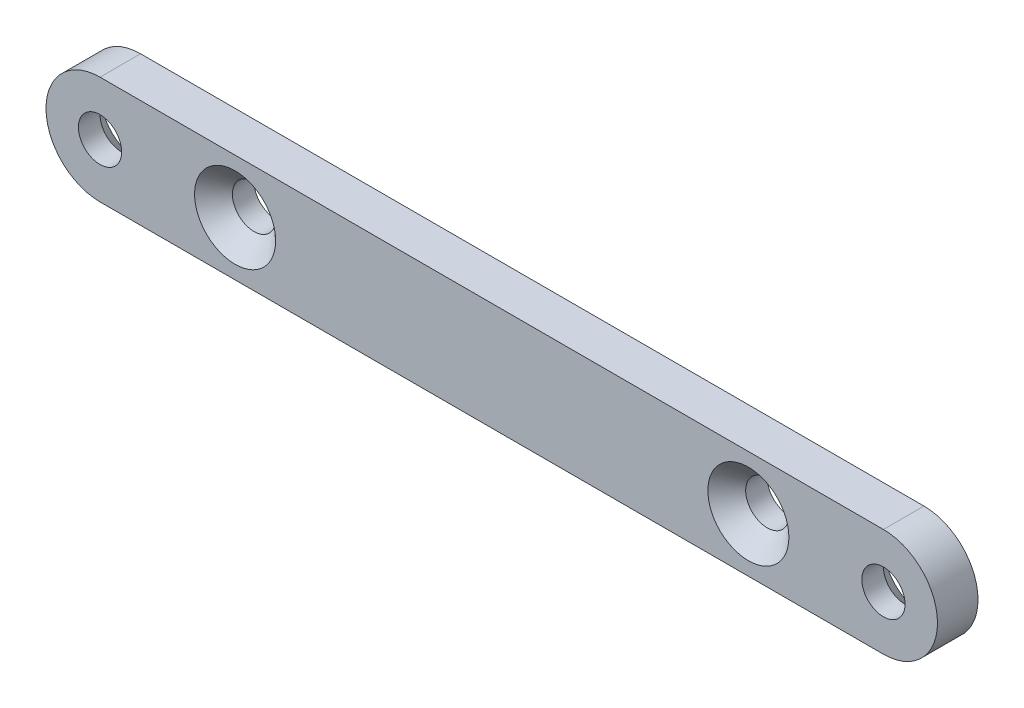
ISO-10303-21;
HEADER;
FILE_DESCRIPTION(('STEP AP214'),'2;1');
FILE_NAME('part.step','',(''),(''),'','','');
FILE_SCHEMA(('AUTOMOTIVE_DESIGN { 1 0 10303 214 1 1 1 1 }'));
ENDSEC;
DATA;
#1=APPLICATION_CONTEXT('core data for automotive mechanical design processes');
#2=APPLICATION_PROTOCOL_DEFINITION('international standard','automotive_design',2000,#1);
#3=PRODUCT_CONTEXT('',#1,'mechanical');
#4=PRODUCT('Part','Part','',(#3));
#5=PRODUCT_RELATED_PRODUCT_CATEGORY('part','',(#4));
#6=PRODUCT_DEFINITION_FORMATION('','',#4);
#7=PRODUCT_DEFINITION_CONTEXT('part definition',#1,'design');
#8=PRODUCT_DEFINITION('design','',#6,#7);
#9=PRODUCT_DEFINITION_SHAPE('','',#8);
#10=(LENGTH_UNIT() NAMED_UNIT(*) SI_UNIT(.MILLI.,.METRE.));
#11=(NAMED_UNIT(*) PLANE_ANGLE_UNIT() SI_UNIT($,.RADIAN.));
#12=(NAMED_UNIT(*) SI_UNIT($,.STERADIAN.) SOLID_ANGLE_UNIT());
#13=UNCERTAINTY_MEASURE_WITH_UNIT(LENGTH_MEASURE(1.E-05),#10,'distance_accuracy_value','');
#14=(GEOMETRIC_REPRESENTATION_CONTEXT(3) GLOBAL_UNCERTAINTY_ASSIGNED_CONTEXT((#13)) GLOBAL_UNIT_ASSIGNED_CONTEXT((#10,
#11,#12)) REPRESENTATION_CONTEXT('',''));
#15=CARTESIAN_POINT('',(0.,0.,0.));
#16=DIRECTION('',(0.,0.,1.));
#17=DIRECTION('',(1.,0.,0.));
#18=AXIS2_PLACEMENT_3D('',#15,#16,#17);
#19=CARTESIAN_POINT('',(0.,-4.,3.));
#20=DIRECTION('',(0.,1.,0.));
#21=DIRECTION('',(0.,0.,1.));
#22=AXIS2_PLACEMENT_3D('',#19,#20,#21);
#23=PLANE('',#22);
#24=DIRECTION('',(1.,0.,0.));
#25=VECTOR('',#24,1.);
#26=CARTESIAN_POINT('',(0.,-4.,0.));
#27=LINE('',#26,#25);
#28=CARTESIAN_POINT('',(-10.,-4.,0.));
#29=VERTEX_POINT('',#28);
#30=CARTESIAN_POINT('',(48.,-4.,0.));
#31=VERTEX_POINT('',#30);
#32=EDGE_CURVE('E113',#29,#31,#27,.T.);
#33=ORIENTED_EDGE('',*,*,#32,.T.);
#34=DIRECTION('',(0.,0.,-1.));
#35=VECTOR('',#34,1.);
#36=CARTESIAN_POINT('',(48.,-4.,3.));
#37=LINE('',#36,#35);
#38=CARTESIAN_POINT('',(48.,-4.,3.));
#39=VERTEX_POINT('',#38);
#40=EDGE_CURVE('E99',#39,#31,#37,.T.);
#41=ORIENTED_EDGE('',*,*,#40,.F.);
#42=DIRECTION('',(1.,0.,0.));
#43=VECTOR('',#42,1.);
#44=CARTESIAN_POINT('',(0.,-4.,3.));
#45=LINE('',#44,#43);
#46=CARTESIAN_POINT('',(-10.,-4.,3.));
#47=VERTEX_POINT('',#46);
#48=EDGE_CURVE('E89',#47,#39,#45,.T.);
#49=ORIENTED_EDGE('',*,*,#48,.F.);
#50=DIRECTION('',(0.,0.,-1.));
#51=VECTOR('',#50,1.);
#52=CARTESIAN_POINT('',(-10.,-4.,3.));
#53=LINE('',#52,#51);
#54=EDGE_CURVE('E103',#47,#29,#53,.T.);
#55=ORIENTED_EDGE('',*,*,#54,.T.);
#56=EDGE_LOOP('',(#33,#41,#49,#55));
#57=FACE_BOUND('',#56,.T.);
#58=ADVANCED_FACE('F39',(#57),#23,.F.);
#59=CARTESIAN_POINT('',(48.,0.,3.));
#60=DIRECTION('',(0.,0.,-1.));
#61=DIRECTION('',(-1.,0.,0.));
#62=AXIS2_PLACEMENT_3D('',#59,#60,#61);
#63=CYLINDRICAL_SURFACE('',#62,4.);
#64=CARTESIAN_POINT('',(48.,0.,0.));
#65=DIRECTION('',(0.,0.,1.));
#66=DIRECTION('',(1.,0.,0.));
#67=AXIS2_PLACEMENT_3D('',#64,#65,#66);
#68=CIRCLE('',#67,4.);
#69=CARTESIAN_POINT('',(48.,4.,0.));
#70=VERTEX_POINT('',#69);
#71=EDGE_CURVE('E95',#31,#70,#68,.T.);
#72=ORIENTED_EDGE('',*,*,#71,.T.);
#73=DIRECTION('',(0.,0.,-1.));
#74=VECTOR('',#73,1.);
#75=CARTESIAN_POINT('',(48.,4.,3.));
#76=LINE('',#75,#74);
#77=CARTESIAN_POINT('',(48.,4.,3.));
#78=VERTEX_POINT('',#77);
#79=EDGE_CURVE('E93',#78,#70,#76,.T.);
#80=ORIENTED_EDGE('',*,*,#79,.F.);
#81=CARTESIAN_POINT('',(48.,0.,3.));
#82=DIRECTION('',(0.,0.,1.));
#83=DIRECTION('',(1.,0.,0.));
#84=AXIS2_PLACEMENT_3D('',#81,#82,#83);
#85=CIRCLE('',#84,4.);
#86=EDGE_CURVE('E84',#39,#78,#85,.T.);
#87=ORIENTED_EDGE('',*,*,#86,.F.);
#88=ORIENTED_EDGE('',*,*,#40,.T.);
#89=EDGE_LOOP('',(#72,#80,#87,#88));
#90=FACE_BOUND('',#89,.T.);
#91=ADVANCED_FACE('F94',(#90),#63,.T.);
#92=CARTESIAN_POINT('',(0.,4.,3.));
#93=DIRECTION('',(0.,1.,0.));
#94=DIRECTION('',(0.,0.,1.));
#95=AXIS2_PLACEMENT_3D('',#92,#93,#94);
#96=PLANE('',#95);
#97=DIRECTION('',(1.,0.,0.));
#98=VECTOR('',#97,1.);
#99=CARTESIAN_POINT('',(0.,4.,0.));
#100=LINE('',#99,#98);
#101=CARTESIAN_POINT('',(-10.,4.,0.));
#102=VERTEX_POINT('',#101);
#103=EDGE_CURVE('E117',#102,#70,#100,.T.);
#104=ORIENTED_EDGE('',*,*,#103,.F.);
#105=DIRECTION('',(0.,0.,-1.));
#106=VECTOR('',#105,1.);
#107=CARTESIAN_POINT('',(-10.,4.,3.));
#108=LINE('',#107,#106);
#109=CARTESIAN_POINT('',(-10.,4.,3.));
#110=VERTEX_POINT('',#109);
#111=EDGE_CURVE('E73',#110,#102,#108,.T.);
#112=ORIENTED_EDGE('',*,*,#111,.F.);
#113=DIRECTION('',(1.,0.,0.));
#114=VECTOR('',#113,1.);
#115=CARTESIAN_POINT('',(0.,4.,3.));
#116=LINE('',#115,#114);
#117=EDGE_CURVE('E87',#110,#78,#116,.T.);
#118=ORIENTED_EDGE('',*,*,#117,.T.);
#119=ORIENTED_EDGE('',*,*,#79,.T.);
#120=EDGE_LOOP('',(#104,#112,#118,#119));
#121=FACE_BOUND('',#120,.T.);
#122=ADVANCED_FACE('F101',(#121),#96,.T.);
#123=CARTESIAN_POINT('',(-10.,0.,3.));
#124=DIRECTION('',(0.,0.,-1.));
#125=DIRECTION('',(-1.,0.,0.));
#126=AXIS2_PLACEMENT_3D('',#123,#124,#125);
#127=CYLINDRICAL_SURFACE('',#126,1.6);
#128=CARTESIAN_POINT('',(-10.,0.,1.4));
#129=DIRECTION('',(0.,0.,1.));
#130=DIRECTION('',(1.,0.,0.));
#131=AXIS2_PLACEMENT_3D('',#128,#129,#130);
#132=CIRCLE('',#131,1.6);
#133=CARTESIAN_POINT('',(-8.4,0.,1.4));
#134=VERTEX_POINT('',#133);
#135=EDGE_CURVE('E133',#134,#134,#132,.F.);
#136=ORIENTED_EDGE('',*,*,#135,.T.);
#137=EDGE_LOOP('',(#136));
#138=FACE_BOUND('',#137,.T.);
#139=CARTESIAN_POINT('',(-10.,0.,3.));
#140=DIRECTION('',(0.,0.,1.));
#141=DIRECTION('',(1.,0.,0.));
#142=AXIS2_PLACEMENT_3D('',#139,#140,#141);
#143=CIRCLE('',#142,1.6);
#144=CARTESIAN_POINT('',(-8.4,0.,3.));
#145=VERTEX_POINT('',#144);
#146=EDGE_CURVE('E221',#145,#145,#143,.T.);
#147=ORIENTED_EDGE('',*,*,#146,.T.);
#148=EDGE_LOOP('',(#147));
#149=FACE_BOUND('',#148,.T.);
#150=ADVANCED_FACE('F186',(#138,#149),#127,.F.);
#151=CARTESIAN_POINT('',(48.,0.,3.));
#152=DIRECTION('',(0.,0.,-1.));
#153=DIRECTION('',(-1.,0.,0.));
#154=AXIS2_PLACEMENT_3D('',#151,#152,#153);
#155=CYLINDRICAL_SURFACE('',#154,1.6);
#156=CARTESIAN_POINT('',(48.,0.,1.40000000000001));
#157=DIRECTION('',(0.,0.,1.));
#158=DIRECTION('',(1.,0.,0.));
#159=AXIS2_PLACEMENT_3D('',#156,#157,#158);
#160=CIRCLE('',#159,1.6);
#161=CARTESIAN_POINT('',(49.6,0.,1.40000000000001));
#162=VERTEX_POINT('',#161);
#163=EDGE_CURVE('E130',#162,#162,#160,.F.);
#164=ORIENTED_EDGE('',*,*,#163,.T.);
#165=EDGE_LOOP('',(#164));
#166=FACE_BOUND('',#165,.T.);
#167=CARTESIAN_POINT('',(48.,0.,3.));
#168=DIRECTION('',(0.,0.,1.));
#169=DIRECTION('',(1.,0.,0.));
#170=AXIS2_PLACEMENT_3D('',#167,#168,#169);
#171=CIRCLE('',#170,1.6);
#172=CARTESIAN_POINT('',(49.6,0.,3.));
#173=VERTEX_POINT('',#172);
#174=EDGE_CURVE('E120',#173,#173,#171,.T.);
#175=ORIENTED_EDGE('',*,*,#174,.T.);
#176=EDGE_LOOP('',(#175));
#177=FACE_BOUND('',#176,.T.);
#178=ADVANCED_FACE('F156',(#166,#177),#155,.F.);
#179=CARTESIAN_POINT('',(38.,0.,3.));
#180=DIRECTION('',(0.,0.,-1.));
#181=DIRECTION('',(-1.,0.,0.));
#182=AXIS2_PLACEMENT_3D('',#179,#180,#181);
#183=CYLINDRICAL_SURFACE('',#182,1.6);
#184=CARTESIAN_POINT('',(38.,0.,1.59999999999998));
#185=DIRECTION('',(0.,0.,1.));
#186=DIRECTION('',(1.,0.,0.));
#187=AXIS2_PLACEMENT_3D('',#184,#185,#186);
#188=CIRCLE('',#187,1.6);
#189=CARTESIAN_POINT('',(39.6,0.,1.59999999999998));
#190=VERTEX_POINT('',#189);
#191=EDGE_CURVE('E136',#190,#190,#188,.T.);
#192=ORIENTED_EDGE('',*,*,#191,.T.);
#193=EDGE_LOOP('',(#192));
#194=FACE_BOUND('',#193,.T.);
#195=CARTESIAN_POINT('',(38.,0.,0.));
#196=DIRECTION('',(0.,0.,1.));
#197=DIRECTION('',(1.,0.,0.));
#198=AXIS2_PLACEMENT_3D('',#195,#196,#197);
#199=CIRCLE('',#198,1.6);
#200=CARTESIAN_POINT('',(39.6,0.,0.));
#201=VERTEX_POINT('',#200);
#202=EDGE_CURVE('E110',#201,#201,#199,.T.);
#203=ORIENTED_EDGE('',*,*,#202,.F.);
#204=EDGE_LOOP('',(#203));
#205=FACE_BOUND('',#204,.T.);
#206=ADVANCED_FACE('F152',(#194,#205),#183,.F.);
#207=CARTESIAN_POINT('',(0.,0.,3.));
#208=DIRECTION('',(0.,0.,-1.));
#209=DIRECTION('',(-1.,0.,0.));
#210=AXIS2_PLACEMENT_3D('',#207,#208,#209);
#211=CYLINDRICAL_SURFACE('',#210,1.6);
#212=CARTESIAN_POINT('',(0.,0.,1.59999999999999));
#213=DIRECTION('',(0.,0.,1.));
#214=DIRECTION('',(1.,0.,0.));
#215=AXIS2_PLACEMENT_3D('',#212,#213,#214);
#216=CIRCLE('',#215,1.6);
#217=CARTESIAN_POINT('',(1.6,0.,1.59999999999998));
#218=VERTEX_POINT('',#217);
#219=EDGE_CURVE('E11',#218,#218,#216,.T.);
#220=ORIENTED_EDGE('',*,*,#219,.T.);
#221=EDGE_LOOP('',(#220));
#222=FACE_BOUND('',#221,.T.);
#223=CARTESIAN_POINT('',(0.,0.,0.));
#224=DIRECTION('',(0.,0.,1.));
#225=DIRECTION('',(1.,0.,0.));
#226=AXIS2_PLACEMENT_3D('',#223,#224,#225);
#227=CIRCLE('',#226,1.6);
#228=CARTESIAN_POINT('',(1.6,0.,0.));
#229=VERTEX_POINT('',#228);
#230=EDGE_CURVE('E107',#229,#229,#227,.T.);
#231=ORIENTED_EDGE('',*,*,#230,.F.);
#232=EDGE_LOOP('',(#231));
#233=FACE_BOUND('',#232,.T.);
#234=ADVANCED_FACE('F155',(#222,#233),#211,.F.);
#235=CARTESIAN_POINT('',(-10.,0.,3.));
#236=DIRECTION('',(0.,0.,-1.));
#237=DIRECTION('',(-1.,0.,0.));
#238=AXIS2_PLACEMENT_3D('',#235,#236,#237);
#239=CYLINDRICAL_SURFACE('',#238,4.);
#240=CARTESIAN_POINT('',(-10.,0.,0.));
#241=DIRECTION('',(0.,0.,1.));
#242=DIRECTION('',(1.,0.,0.));
#243=AXIS2_PLACEMENT_3D('',#240,#241,#242);
#244=CIRCLE('',#243,4.);
#245=EDGE_CURVE('E76',#102,#29,#244,.T.);
#246=ORIENTED_EDGE('',*,*,#245,.T.);
#247=ORIENTED_EDGE('',*,*,#54,.F.);
#248=CARTESIAN_POINT('',(-10.,0.,3.));
#249=DIRECTION('',(0.,0.,1.));
#250=DIRECTION('',(1.,0.,0.));
#251=AXIS2_PLACEMENT_3D('',#248,#249,#250);
#252=CIRCLE('',#251,4.);
#253=EDGE_CURVE('E57',#110,#47,#252,.T.);
#254=ORIENTED_EDGE('',*,*,#253,.F.);
#255=ORIENTED_EDGE('',*,*,#111,.T.);
#256=EDGE_LOOP('',(#246,#247,#254,#255));
#257=FACE_BOUND('',#256,.T.);
#258=ADVANCED_FACE('F168',(#257),#239,.T.);
#259=CARTESIAN_POINT('',(0.,0.,3.));
#260=DIRECTION('',(0.,0.,1.));
#261=DIRECTION('',(1.,0.,0.));
#262=AXIS2_PLACEMENT_3D('',#259,#260,#261);
#263=PLANE('',#262);
#264=CARTESIAN_POINT('',(38.,0.,3.));
#265=DIRECTION('',(0.,0.,1.));
#266=DIRECTION('',(1.,0.,0.));
#267=AXIS2_PLACEMENT_3D('',#264,#265,#266);
#268=CIRCLE('',#267,3.00000000000002);
#269=CARTESIAN_POINT('',(41.,0.,3.));
#270=VERTEX_POINT('',#269);
#271=EDGE_CURVE('E49',#270,#270,#268,.F.);
#272=ORIENTED_EDGE('',*,*,#271,.T.);
#273=EDGE_LOOP('',(#272));
#274=FACE_BOUND('',#273,.T.);
#275=CARTESIAN_POINT('',(0.,0.,3.));
#276=DIRECTION('',(0.,0.,1.));
#277=DIRECTION('',(1.,0.,0.));
#278=AXIS2_PLACEMENT_3D('',#275,#276,#277);
#279=CIRCLE('',#278,3.00000000000002);
#280=CARTESIAN_POINT('',(3.00000000000002,0.,3.));
#281=VERTEX_POINT('',#280);
#282=EDGE_CURVE('E139',#281,#281,#279,.F.);
#283=ORIENTED_EDGE('',*,*,#282,.T.);
#284=EDGE_LOOP('',(#283));
#285=FACE_BOUND('',#284,.T.);
#286=ORIENTED_EDGE('',*,*,#174,.F.);
#287=EDGE_LOOP('',(#286));
#288=FACE_BOUND('',#287,.T.);
#289=ORIENTED_EDGE('',*,*,#146,.F.);
#290=EDGE_LOOP('',(#289));
#291=FACE_BOUND('',#290,.T.);
#292=ORIENTED_EDGE('',*,*,#48,.T.);
#293=ORIENTED_EDGE('',*,*,#86,.T.);
#294=ORIENTED_EDGE('',*,*,#117,.F.);
#295=ORIENTED_EDGE('',*,*,#253,.T.);
#296=EDGE_LOOP('',(#292,#293,#294,#295));
#297=FACE_BOUND('',#296,.T.);
#298=ADVANCED_FACE('F85',(#274,#285,#288,#291,#297),#263,.T.);
#299=CARTESIAN_POINT('',(0.,0.,0.));
#300=DIRECTION('',(0.,0.,1.));
#301=DIRECTION('',(1.,0.,0.));
#302=AXIS2_PLACEMENT_3D('',#299,#300,#301);
#303=PLANE('',#302);
#304=CARTESIAN_POINT('',(48.,0.,0.));
#305=DIRECTION('',(0.,0.,1.));
#306=DIRECTION('',(1.,0.,0.));
#307=AXIS2_PLACEMENT_3D('',#304,#305,#306);
#308=CIRCLE('',#307,3.);
#309=CARTESIAN_POINT('',(51.,0.,0.));
#310=VERTEX_POINT('',#309);
#311=EDGE_CURVE('E127',#310,#310,#308,.T.);
#312=ORIENTED_EDGE('',*,*,#311,.T.);
#313=EDGE_LOOP('',(#312));
#314=FACE_BOUND('',#313,.T.);
#315=CARTESIAN_POINT('',(-10.,0.,0.));
#316=DIRECTION('',(0.,0.,1.));
#317=DIRECTION('',(1.,0.,0.));
#318=AXIS2_PLACEMENT_3D('',#315,#316,#317);
#319=CIRCLE('',#318,2.99999999999999);
#320=CARTESIAN_POINT('',(-7.00000000000001,0.,0.));
#321=VERTEX_POINT('',#320);
#322=EDGE_CURVE('E124',#321,#321,#319,.T.);
#323=ORIENTED_EDGE('',*,*,#322,.T.);
#324=EDGE_LOOP('',(#323));
#325=FACE_BOUND('',#324,.T.);
#326=ORIENTED_EDGE('',*,*,#230,.T.);
#327=EDGE_LOOP('',(#326));
#328=FACE_BOUND('',#327,.T.);
#329=ORIENTED_EDGE('',*,*,#202,.T.);
#330=EDGE_LOOP('',(#329));
#331=FACE_BOUND('',#330,.T.);
#332=ORIENTED_EDGE('',*,*,#32,.F.);
#333=ORIENTED_EDGE('',*,*,#245,.F.);
#334=ORIENTED_EDGE('',*,*,#103,.T.);
#335=ORIENTED_EDGE('',*,*,#71,.F.);
#336=EDGE_LOOP('',(#332,#333,#334,#335));
#337=FACE_BOUND('',#336,.T.);
#338=ADVANCED_FACE('F160',(#314,#325,#328,#331,#337),#303,.F.);
#339=CARTESIAN_POINT('',(48.,0.,0.));
#340=DIRECTION('',(0.,0.,-1.));
#341=DIRECTION('',(-1.,0.,0.));
#342=AXIS2_PLACEMENT_3D('',#339,#340,#341);
#343=CONICAL_SURFACE('',#342,3.,0.785398163397445);
#344=ORIENTED_EDGE('',*,*,#163,.F.);
#345=EDGE_LOOP('',(#344));
#346=FACE_BOUND('',#345,.T.);
#347=ORIENTED_EDGE('',*,*,#311,.F.);
#348=EDGE_LOOP('',(#347));
#349=FACE_BOUND('',#348,.T.);
#350=ADVANCED_FACE('F163',(#346,#349),#343,.F.);
#351=CARTESIAN_POINT('',(-10.,0.,0.));
#352=DIRECTION('',(0.,0.,-1.));
#353=DIRECTION('',(-1.,0.,0.));
#354=AXIS2_PLACEMENT_3D('',#351,#352,#353);
#355=CONICAL_SURFACE('',#354,2.99999999999999,0.785398163397445);
#356=ORIENTED_EDGE('',*,*,#135,.F.);
#357=EDGE_LOOP('',(#356));
#358=FACE_BOUND('',#357,.T.);
#359=ORIENTED_EDGE('',*,*,#322,.F.);
#360=EDGE_LOOP('',(#359));
#361=FACE_BOUND('',#360,.T.);
#362=ADVANCED_FACE('F149',(#358,#361),#355,.F.);
#363=CARTESIAN_POINT('',(38.,0.,1.59999999999998));
#364=DIRECTION('',(0.,0.,1.));
#365=DIRECTION('',(1.,0.,0.));
#366=AXIS2_PLACEMENT_3D('',#363,#364,#365);
#367=CONICAL_SURFACE('',#366,1.6,0.785398163397449);
#368=ORIENTED_EDGE('',*,*,#271,.F.);
#369=EDGE_LOOP('',(#368));
#370=FACE_BOUND('',#369,.T.);
#371=ORIENTED_EDGE('',*,*,#191,.F.);
#372=EDGE_LOOP('',(#371));
#373=FACE_BOUND('',#372,.T.);
#374=ADVANCED_FACE('F146',(#370,#373),#367,.F.);
#375=CARTESIAN_POINT('',(0.,0.,1.59999999999999));
#376=DIRECTION('',(0.,0.,1.));
#377=DIRECTION('',(1.,0.,0.));
#378=AXIS2_PLACEMENT_3D('',#375,#376,#377);
#379=CONICAL_SURFACE('',#378,1.6,0.785398163397449);
#380=CARTESIAN_POINT('',(3.00000000000002,0.,3.));
#381=CARTESIAN_POINT('',(2.98541666666668,0.,2.98541666666667));
#382=CARTESIAN_POINT('',(2.97083333333335,0.,2.97083333333333));
#383=CARTESIAN_POINT('',(2.94166666666668,0.,2.94166666666667));
#384=CARTESIAN_POINT('',(2.92708333333335,0.,2.92708333333333));
#385=CARTESIAN_POINT('',(2.89791666666668,0.,2.89791666666667));
#386=CARTESIAN_POINT('',(2.88333333333335,0.,2.88333333333333));
#387=CARTESIAN_POINT('',(2.85416666666668,0.,2.85416666666667));
#388=CARTESIAN_POINT('',(2.83958333333335,0.,2.83958333333333));
#389=CARTESIAN_POINT('',(2.81041666666668,0.,2.81041666666666));
#390=CARTESIAN_POINT('',(2.79583333333335,0.,2.79583333333333));
#391=CARTESIAN_POINT('',(2.76666666666668,0.,2.76666666666666));
#392=CARTESIAN_POINT('',(2.75208333333335,0.,2.75208333333333));
#393=CARTESIAN_POINT('',(2.72291666666668,0.,2.72291666666666));
#394=CARTESIAN_POINT('',(2.70833333333335,0.,2.70833333333333));
#395=CARTESIAN_POINT('',(2.67916666666668,0.,2.67916666666666));
#396=CARTESIAN_POINT('',(2.66458333333335,0.,2.66458333333333));
#397=CARTESIAN_POINT('',(2.63541666666668,0.,2.63541666666666));
#398=CARTESIAN_POINT('',(2.62083333333335,0.,2.62083333333333));
#399=CARTESIAN_POINT('',(2.59166666666668,0.,2.59166666666666));
#400=CARTESIAN_POINT('',(2.57708333333334,0.,2.57708333333333));
#401=CARTESIAN_POINT('',(2.54791666666668,0.,2.54791666666666));
#402=CARTESIAN_POINT('',(2.53333333333334,0.,2.53333333333333));
#403=CARTESIAN_POINT('',(2.50416666666668,0.,2.50416666666666));
#404=CARTESIAN_POINT('',(2.48958333333334,0.,2.48958333333333));
#405=CARTESIAN_POINT('',(2.46041666666668,0.,2.46041666666666));
#406=CARTESIAN_POINT('',(2.44583333333334,0.,2.44583333333333));
#407=CARTESIAN_POINT('',(2.41666666666668,0.,2.41666666666666));
#408=CARTESIAN_POINT('',(2.40208333333334,0.,2.40208333333333));
#409=CARTESIAN_POINT('',(2.37291666666668,0.,2.37291666666666));
#410=CARTESIAN_POINT('',(2.35833333333334,0.,2.35833333333333));
#411=CARTESIAN_POINT('',(2.32916666666668,0.,2.32916666666666));
#412=CARTESIAN_POINT('',(2.31458333333334,0.,2.31458333333333));
#413=CARTESIAN_POINT('',(2.28541666666667,0.,2.28541666666666));
#414=CARTESIAN_POINT('',(2.27083333333334,0.,2.27083333333333));
#415=CARTESIAN_POINT('',(2.24166666666667,0.,2.24166666666666));
#416=CARTESIAN_POINT('',(2.22708333333334,0.,2.22708333333332));
#417=CARTESIAN_POINT('',(2.19791666666667,0.,2.19791666666666));
#418=CARTESIAN_POINT('',(2.18333333333334,0.,2.18333333333332));
#419=CARTESIAN_POINT('',(2.15416666666667,0.,2.15416666666666));
#420=CARTESIAN_POINT('',(2.13958333333334,0.,2.13958333333332));
#421=CARTESIAN_POINT('',(2.11041666666667,0.,2.11041666666666));
#422=CARTESIAN_POINT('',(2.09583333333334,0.,2.09583333333332));
#423=CARTESIAN_POINT('',(2.06666666666667,0.,2.06666666666666));
#424=CARTESIAN_POINT('',(2.05208333333334,0.,2.05208333333332));
#425=CARTESIAN_POINT('',(2.02291666666667,0.,2.02291666666666));
#426=CARTESIAN_POINT('',(2.00833333333334,0.,2.00833333333332));
#427=CARTESIAN_POINT('',(1.97916666666667,0.,1.97916666666666));
#428=CARTESIAN_POINT('',(1.96458333333334,0.,1.96458333333332));
#429=CARTESIAN_POINT('',(1.93541666666667,0.,1.93541666666666));
#430=CARTESIAN_POINT('',(1.92083333333334,0.,1.92083333333332));
#431=CARTESIAN_POINT('',(1.89166666666667,0.,1.89166666666665));
#432=CARTESIAN_POINT('',(1.87708333333334,0.,1.87708333333332));
#433=CARTESIAN_POINT('',(1.84791666666667,0.,1.84791666666665));
#434=CARTESIAN_POINT('',(1.83333333333334,0.,1.83333333333332));
#435=CARTESIAN_POINT('',(1.80416666666667,0.,1.80416666666665));
#436=CARTESIAN_POINT('',(1.78958333333334,0.,1.78958333333332));
#437=CARTESIAN_POINT('',(1.76041666666667,0.,1.76041666666665));
#438=CARTESIAN_POINT('',(1.74583333333333,0.,1.74583333333332));
#439=CARTESIAN_POINT('',(1.71666666666667,0.,1.71666666666665));
#440=CARTESIAN_POINT('',(1.70208333333333,0.,1.70208333333332));
#441=CARTESIAN_POINT('',(1.67291666666667,0.,1.67291666666665));
#442=CARTESIAN_POINT('',(1.65833333333333,0.,1.65833333333332));
#443=CARTESIAN_POINT('',(1.62916666666667,0.,1.62916666666665));
#444=CARTESIAN_POINT('',(1.61458333333333,0.,1.61458333333332));
#445=CARTESIAN_POINT('',(1.6,0.,1.59999999999998));
#446=B_SPLINE_CURVE_WITH_KNOTS('',3,(#380,#381,#382,#383,#384,#385,#386,#387,#388,#389,#390,
#391,#392,#393,#394,#395,#396,#397,#398,#399,#400,#401,#402,#403,#404,#405,#406,#407,#408,#409,
#410,#411,#412,#413,#414,#415,#416,#417,#418,#419,#420,#421,#422,#423,#424,#425,#426,#427,#428,
#429,#430,#431,#432,#433,#434,#435,#436,#437,#438,#439,#440,#441,#442,#443,#444,#445),
.UNSPECIFIED.,.F.,.F.,(4,2,2,2,2,2,2,2,2,2,2,2,2,2,2,2,2,2,2,2,2,2,2,2,2,2,2,2,2,2,2,2,4),(0.,
0.0618718433538235,0.123743686707647,0.185615530061471,0.247487373415295,0.309359216769119,
0.371231060122942,0.433102903476765,0.494974746830589,0.556846590184413,0.618718433538236,
0.68059027689206,0.742462120245884,0.804333963599707,0.86620580695353,0.928077650307354,
0.989949493661178,1.051821337015,1.11369318036883,1.17556502372265,1.23743686707647,
1.2993087104303,1.36118055378412,1.42305239713794,1.48492424049177,1.54679608384559,
1.60866792719941,1.67053977055324,1.73241161390706,1.79428345726088,1.85615530061471,
1.91802714396853,1.97989898732236),.UNSPECIFIED.);
#447=EDGE_CURVE('BSEAM42',#281,#218,#446,.T.);
#448=ORIENTED_EDGE('',*,*,#282,.F.);
#449=ORIENTED_EDGE('',*,*,#219,.F.);
#450=ORIENTED_EDGE('',*,*,#447,.T.);
#451=ORIENTED_EDGE('',*,*,#447,.F.);
#452=EDGE_LOOP('',(#448,#450,#449,#451));
#453=FACE_BOUND('',#452,.T.);
#454=ADVANCED_FACE('F42',(#453),#379,.F.);
#455=CLOSED_SHELL('',(#58,#91,#122,#150,#178,#206,#234,#258,#298,#338,#350,#362,#374,#454));
#456=MANIFOLD_SOLID_BREP('B2',#455);
#457=ADVANCED_BREP_SHAPE_REPRESENTATION('',(#18,#456),#14);
#458=SHAPE_DEFINITION_REPRESENTATION(#9,#457);
ENDSEC;
END-ISO-10303-21;
